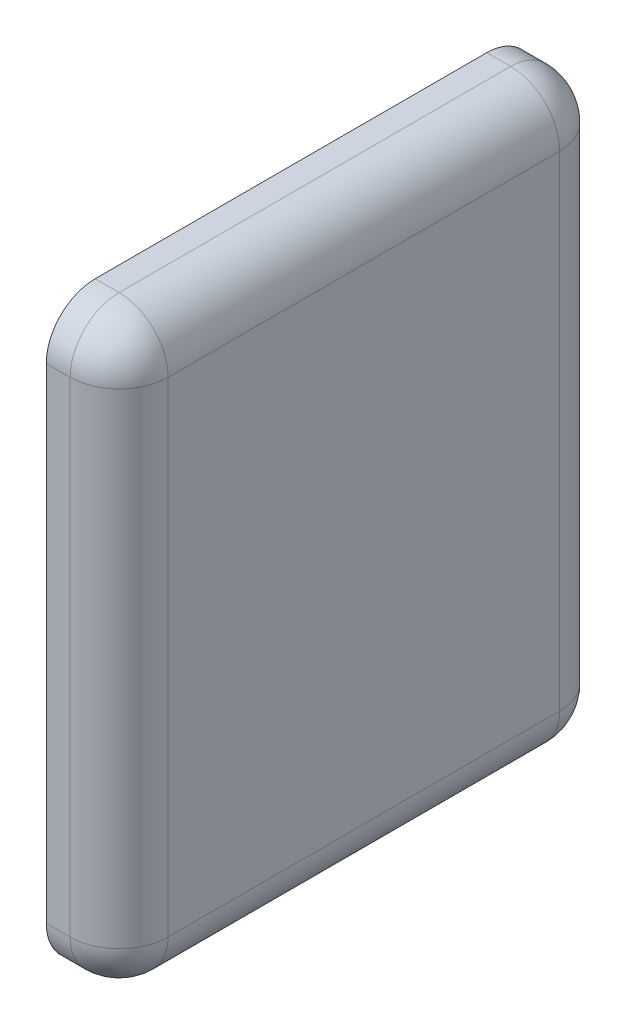
ISO-10303-21;
HEADER;
FILE_DESCRIPTION(('STEP AP214'),'2;1');
FILE_NAME('part.step','',(''),(''),'','','');
FILE_SCHEMA(('AUTOMOTIVE_DESIGN { 1 0 10303 214 1 1 1 1 }'));
ENDSEC;
DATA;
#1=APPLICATION_CONTEXT('core data for automotive mechanical design processes');
#2=APPLICATION_PROTOCOL_DEFINITION('international standard','automotive_design',2000,#1);
#3=PRODUCT_CONTEXT('',#1,'mechanical');
#4=PRODUCT('Part','Part','',(#3));
#5=PRODUCT_RELATED_PRODUCT_CATEGORY('part','',(#4));
#6=PRODUCT_DEFINITION_FORMATION('','',#4);
#7=PRODUCT_DEFINITION_CONTEXT('part definition',#1,'design');
#8=PRODUCT_DEFINITION('design','',#6,#7);
#9=PRODUCT_DEFINITION_SHAPE('','',#8);
#10=(LENGTH_UNIT() NAMED_UNIT(*) SI_UNIT(.MILLI.,.METRE.));
#11=(NAMED_UNIT(*) PLANE_ANGLE_UNIT() SI_UNIT($,.RADIAN.));
#12=(NAMED_UNIT(*) SI_UNIT($,.STERADIAN.) SOLID_ANGLE_UNIT());
#13=UNCERTAINTY_MEASURE_WITH_UNIT(LENGTH_MEASURE(1.E-05),#10,'distance_accuracy_value','');
#14=(GEOMETRIC_REPRESENTATION_CONTEXT(3) GLOBAL_UNCERTAINTY_ASSIGNED_CONTEXT((#13)) GLOBAL_UNIT_ASSIGNED_CONTEXT((#10,
#11,#12)) REPRESENTATION_CONTEXT('',''));
#15=CARTESIAN_POINT('',(0.,0.,0.));
#16=DIRECTION('',(0.,0.,1.));
#17=DIRECTION('',(1.,0.,0.));
#18=AXIS2_PLACEMENT_3D('',#15,#16,#17);
#19=CARTESIAN_POINT('',(2.225,-2.5,0.));
#20=DIRECTION('',(1.,0.,0.));
#21=DIRECTION('',(0.,0.,1.));
#22=AXIS2_PLACEMENT_3D('',#19,#20,#21);
#23=PLANE('',#22);
#24=CARTESIAN_POINT('',(2.225,-2.08,3.78));
#25=DIRECTION('',(-1.,0.,0.));
#26=DIRECTION('',(0.,0.,1.));
#27=AXIS2_PLACEMENT_3D('',#24,#25,#26);
#28=CIRCLE('',#27,0.42);
#29=CARTESIAN_POINT('',(2.225,-2.5,3.78));
#30=VERTEX_POINT('',#29);
#31=CARTESIAN_POINT('',(2.225,-2.08,4.2));
#32=VERTEX_POINT('',#31);
#33=EDGE_CURVE('E11',#30,#32,#28,.T.);
#34=ORIENTED_EDGE('',*,*,#33,.T.);
#35=DIRECTION('',(0.,1.,0.));
#36=VECTOR('',#35,1.);
#37=CARTESIAN_POINT('',(2.225,-2.5,4.2));
#38=LINE('',#37,#36);
#39=CARTESIAN_POINT('',(2.225,2.08,4.2));
#40=VERTEX_POINT('',#39);
#41=EDGE_CURVE('E24',#32,#40,#38,.T.);
#42=ORIENTED_EDGE('',*,*,#41,.T.);
#43=CARTESIAN_POINT('',(2.225,2.08,3.78));
#44=DIRECTION('',(1.,0.,0.));
#45=DIRECTION('',(0.,0.,1.));
#46=AXIS2_PLACEMENT_3D('',#43,#44,#45);
#47=CIRCLE('',#46,0.42);
#48=CARTESIAN_POINT('',(2.225,2.5,3.78));
#49=VERTEX_POINT('',#48);
#50=EDGE_CURVE('E195',#49,#40,#47,.T.);
#51=ORIENTED_EDGE('',*,*,#50,.F.);
#52=DIRECTION('',(0.,0.,1.));
#53=VECTOR('',#52,1.);
#54=CARTESIAN_POINT('',(2.225,2.5,0.));
#55=LINE('',#54,#53);
#56=CARTESIAN_POINT('',(2.225,2.5,0.42));
#57=VERTEX_POINT('',#56);
#58=EDGE_CURVE('E193',#57,#49,#55,.T.);
#59=ORIENTED_EDGE('',*,*,#58,.F.);
#60=CARTESIAN_POINT('',(2.225,2.08,0.42));
#61=DIRECTION('',(-1.,0.,0.));
#62=DIRECTION('',(0.,0.,1.));
#63=AXIS2_PLACEMENT_3D('',#60,#61,#62);
#64=CIRCLE('',#63,0.42);
#65=CARTESIAN_POINT('',(2.225,2.08,0.));
#66=VERTEX_POINT('',#65);
#67=EDGE_CURVE('E190',#57,#66,#64,.T.);
#68=ORIENTED_EDGE('',*,*,#67,.T.);
#69=DIRECTION('',(0.,1.,0.));
#70=VECTOR('',#69,1.);
#71=CARTESIAN_POINT('',(2.225,-2.5,0.));
#72=LINE('',#71,#70);
#73=CARTESIAN_POINT('',(2.225,-2.08,0.));
#74=VERTEX_POINT('',#73);
#75=EDGE_CURVE('E188',#74,#66,#72,.T.);
#76=ORIENTED_EDGE('',*,*,#75,.F.);
#77=CARTESIAN_POINT('',(2.225,-2.08,0.42));
#78=DIRECTION('',(1.,0.,0.));
#79=DIRECTION('',(0.,0.,1.));
#80=AXIS2_PLACEMENT_3D('',#77,#78,#79);
#81=CIRCLE('',#80,0.42);
#82=CARTESIAN_POINT('',(2.225,-2.5,0.42));
#83=VERTEX_POINT('',#82);
#84=EDGE_CURVE('E186',#83,#74,#81,.T.);
#85=ORIENTED_EDGE('',*,*,#84,.F.);
#86=DIRECTION('',(0.,0.,1.));
#87=VECTOR('',#86,1.);
#88=CARTESIAN_POINT('',(2.225,-2.5,0.));
#89=LINE('',#88,#87);
#90=EDGE_CURVE('E36',#83,#30,#89,.T.);
#91=ORIENTED_EDGE('',*,*,#90,.T.);
#92=EDGE_LOOP('',(#34,#42,#51,#59,#68,#76,#85,#91));
#93=FACE_BOUND('',#92,.T.);
#94=ADVANCED_FACE('F17',(#93),#23,.F.);
#95=CARTESIAN_POINT('',(2.225,-2.5,0.));
#96=DIRECTION('',(0.,1.,0.));
#97=DIRECTION('',(0.,0.,1.));
#98=AXIS2_PLACEMENT_3D('',#95,#96,#97);
#99=PLANE('',#98);
#100=DIRECTION('',(1.,0.,0.));
#101=VECTOR('',#100,1.);
#102=CARTESIAN_POINT('',(2.225,-2.5,0.42));
#103=LINE('',#102,#101);
#104=CARTESIAN_POINT('',(2.43,-2.5,0.42));
#105=VERTEX_POINT('',#104);
#106=EDGE_CURVE('E182',#83,#105,#103,.T.);
#107=ORIENTED_EDGE('',*,*,#106,.T.);
#108=DIRECTION('',(0.,0.,1.));
#109=VECTOR('',#108,1.);
#110=CARTESIAN_POINT('',(2.43,-2.5,0.));
#111=LINE('',#110,#109);
#112=CARTESIAN_POINT('',(2.43,-2.5,3.78));
#113=VERTEX_POINT('',#112);
#114=EDGE_CURVE('E179',#105,#113,#111,.T.);
#115=ORIENTED_EDGE('',*,*,#114,.T.);
#116=DIRECTION('',(1.,0.,0.));
#117=VECTOR('',#116,1.);
#118=CARTESIAN_POINT('',(2.225,-2.5,3.78));
#119=LINE('',#118,#117);
#120=EDGE_CURVE('E177',#30,#113,#119,.T.);
#121=ORIENTED_EDGE('',*,*,#120,.F.);
#122=ORIENTED_EDGE('',*,*,#90,.F.);
#123=EDGE_LOOP('',(#107,#115,#121,#122));
#124=FACE_BOUND('',#123,.T.);
#125=ADVANCED_FACE('F227',(#124),#99,.F.);
#126=CARTESIAN_POINT('',(2.225,-2.08,0.42));
#127=DIRECTION('',(1.,0.,0.));
#128=DIRECTION('',(0.,-1.,0.));
#129=AXIS2_PLACEMENT_3D('',#126,#127,#128);
#130=CYLINDRICAL_SURFACE('',#129,0.42);
#131=ORIENTED_EDGE('',*,*,#84,.T.);
#132=DIRECTION('',(1.,0.,0.));
#133=VECTOR('',#132,1.);
#134=CARTESIAN_POINT('',(2.225,-2.08,0.));
#135=LINE('',#134,#133);
#136=CARTESIAN_POINT('',(2.43,-2.08,0.));
#137=VERTEX_POINT('',#136);
#138=EDGE_CURVE('E175',#74,#137,#135,.T.);
#139=ORIENTED_EDGE('',*,*,#138,.T.);
#140=CARTESIAN_POINT('',(2.43,-2.08,0.42));
#141=DIRECTION('',(-1.,0.,0.));
#142=DIRECTION('',(0.,-1.,0.));
#143=AXIS2_PLACEMENT_3D('',#140,#141,#142);
#144=CIRCLE('',#143,0.42);
#145=EDGE_CURVE('E172',#137,#105,#144,.T.);
#146=ORIENTED_EDGE('',*,*,#145,.T.);
#147=ORIENTED_EDGE('',*,*,#106,.F.);
#148=EDGE_LOOP('',(#131,#139,#146,#147));
#149=FACE_BOUND('',#148,.T.);
#150=ADVANCED_FACE('F219',(#149),#130,.T.);
#151=CARTESIAN_POINT('',(2.225,-2.08,3.78));
#152=DIRECTION('',(1.,0.,0.));
#153=DIRECTION('',(0.,-1.,0.));
#154=AXIS2_PLACEMENT_3D('',#151,#152,#153);
#155=CYLINDRICAL_SURFACE('',#154,0.42);
#156=ORIENTED_EDGE('',*,*,#120,.T.);
#157=CARTESIAN_POINT('',(2.43,-2.08,3.78));
#158=DIRECTION('',(1.,0.,0.));
#159=DIRECTION('',(0.,-1.,0.));
#160=AXIS2_PLACEMENT_3D('',#157,#158,#159);
#161=CIRCLE('',#160,0.42);
#162=CARTESIAN_POINT('',(2.43,-2.08,4.2));
#163=VERTEX_POINT('',#162);
#164=EDGE_CURVE('E169',#163,#113,#161,.T.);
#165=ORIENTED_EDGE('',*,*,#164,.F.);
#166=DIRECTION('',(1.,0.,0.));
#167=VECTOR('',#166,1.);
#168=CARTESIAN_POINT('',(2.225,-2.08,4.2));
#169=LINE('',#168,#167);
#170=EDGE_CURVE('E167',#32,#163,#169,.T.);
#171=ORIENTED_EDGE('',*,*,#170,.F.);
#172=ORIENTED_EDGE('',*,*,#33,.F.);
#173=EDGE_LOOP('',(#156,#165,#171,#172));
#174=FACE_BOUND('',#173,.T.);
#175=ADVANCED_FACE('F229',(#174),#155,.T.);
#176=CARTESIAN_POINT('',(2.225,-2.5,0.));
#177=DIRECTION('',(0.,0.,1.));
#178=DIRECTION('',(1.,0.,0.));
#179=AXIS2_PLACEMENT_3D('',#176,#177,#178);
#180=PLANE('',#179);
#181=DIRECTION('',(1.,0.,0.));
#182=VECTOR('',#181,1.);
#183=CARTESIAN_POINT('',(2.225,2.08,0.));
#184=LINE('',#183,#182);
#185=CARTESIAN_POINT('',(2.43,2.08,0.));
#186=VERTEX_POINT('',#185);
#187=EDGE_CURVE('E164',#66,#186,#184,.T.);
#188=ORIENTED_EDGE('',*,*,#187,.T.);
#189=DIRECTION('',(0.,1.,0.));
#190=VECTOR('',#189,1.);
#191=CARTESIAN_POINT('',(2.43,-2.5,0.));
#192=LINE('',#191,#190);
#193=EDGE_CURVE('E162',#137,#186,#192,.T.);
#194=ORIENTED_EDGE('',*,*,#193,.F.);
#195=ORIENTED_EDGE('',*,*,#138,.F.);
#196=ORIENTED_EDGE('',*,*,#75,.T.);
#197=EDGE_LOOP('',(#188,#194,#195,#196));
#198=FACE_BOUND('',#197,.T.);
#199=ADVANCED_FACE('F215',(#198),#180,.F.);
#200=CARTESIAN_POINT('',(2.225,-2.5,4.2));
#201=DIRECTION('',(0.,0.,1.));
#202=DIRECTION('',(1.,0.,0.));
#203=AXIS2_PLACEMENT_3D('',#200,#201,#202);
#204=PLANE('',#203);
#205=ORIENTED_EDGE('',*,*,#41,.F.);
#206=ORIENTED_EDGE('',*,*,#170,.T.);
#207=DIRECTION('',(0.,1.,0.));
#208=VECTOR('',#207,1.);
#209=CARTESIAN_POINT('',(2.43,-2.5,4.2));
#210=LINE('',#209,#208);
#211=CARTESIAN_POINT('',(2.43,2.08,4.2));
#212=VERTEX_POINT('',#211);
#213=EDGE_CURVE('E160',#163,#212,#210,.T.);
#214=ORIENTED_EDGE('',*,*,#213,.T.);
#215=DIRECTION('',(1.,0.,0.));
#216=VECTOR('',#215,1.);
#217=CARTESIAN_POINT('',(2.225,2.08,4.2));
#218=LINE('',#217,#216);
#219=EDGE_CURVE('E157',#40,#212,#218,.T.);
#220=ORIENTED_EDGE('',*,*,#219,.F.);
#221=EDGE_LOOP('',(#205,#206,#214,#220));
#222=FACE_BOUND('',#221,.T.);
#223=ADVANCED_FACE('F200',(#222),#204,.T.);
#224=CARTESIAN_POINT('',(2.225,2.08,0.42));
#225=DIRECTION('',(1.,0.,0.));
#226=DIRECTION('',(0.,1.,0.));
#227=AXIS2_PLACEMENT_3D('',#224,#225,#226);
#228=CYLINDRICAL_SURFACE('',#227,0.42);
#229=DIRECTION('',(1.,0.,0.));
#230=VECTOR('',#229,1.);
#231=CARTESIAN_POINT('',(2.225,2.5,0.42));
#232=LINE('',#231,#230);
#233=CARTESIAN_POINT('',(2.43,2.5,0.42));
#234=VERTEX_POINT('',#233);
#235=EDGE_CURVE('E155',#57,#234,#232,.T.);
#236=ORIENTED_EDGE('',*,*,#235,.T.);
#237=CARTESIAN_POINT('',(2.43,2.08,0.42));
#238=DIRECTION('',(1.,0.,0.));
#239=DIRECTION('',(0.,1.,0.));
#240=AXIS2_PLACEMENT_3D('',#237,#238,#239);
#241=CIRCLE('',#240,0.42);
#242=EDGE_CURVE('E152',#186,#234,#241,.T.);
#243=ORIENTED_EDGE('',*,*,#242,.F.);
#244=ORIENTED_EDGE('',*,*,#187,.F.);
#245=ORIENTED_EDGE('',*,*,#67,.F.);
#246=EDGE_LOOP('',(#236,#243,#244,#245));
#247=FACE_BOUND('',#246,.T.);
#248=ADVANCED_FACE('F211',(#247),#228,.T.);
#249=CARTESIAN_POINT('',(2.225,2.08,3.78));
#250=DIRECTION('',(1.,0.,0.));
#251=DIRECTION('',(0.,1.,0.));
#252=AXIS2_PLACEMENT_3D('',#249,#250,#251);
#253=CYLINDRICAL_SURFACE('',#252,0.42);
#254=ORIENTED_EDGE('',*,*,#50,.T.);
#255=ORIENTED_EDGE('',*,*,#219,.T.);
#256=CARTESIAN_POINT('',(2.43,2.08,3.78));
#257=DIRECTION('',(1.,0.,0.));
#258=DIRECTION('',(0.,0.,1.));
#259=AXIS2_PLACEMENT_3D('',#256,#257,#258);
#260=CIRCLE('',#259,0.42);
#261=CARTESIAN_POINT('',(2.43,2.5,3.78));
#262=VERTEX_POINT('',#261);
#263=EDGE_CURVE('E112',#262,#212,#260,.T.);
#264=ORIENTED_EDGE('',*,*,#263,.F.);
#265=DIRECTION('',(1.,0.,0.));
#266=VECTOR('',#265,1.);
#267=CARTESIAN_POINT('',(2.225,2.5,3.78));
#268=LINE('',#267,#266);
#269=EDGE_CURVE('E148',#49,#262,#268,.T.);
#270=ORIENTED_EDGE('',*,*,#269,.F.);
#271=EDGE_LOOP('',(#254,#255,#264,#270));
#272=FACE_BOUND('',#271,.T.);
#273=ADVANCED_FACE('F202',(#272),#253,.T.);
#274=CARTESIAN_POINT('',(2.225,2.5,0.));
#275=DIRECTION('',(0.,1.,0.));
#276=DIRECTION('',(0.,0.,1.));
#277=AXIS2_PLACEMENT_3D('',#274,#275,#276);
#278=PLANE('',#277);
#279=ORIENTED_EDGE('',*,*,#58,.T.);
#280=ORIENTED_EDGE('',*,*,#269,.T.);
#281=DIRECTION('',(0.,0.,1.));
#282=VECTOR('',#281,1.);
#283=CARTESIAN_POINT('',(2.43,2.5,0.));
#284=LINE('',#283,#282);
#285=EDGE_CURVE('E122',#234,#262,#284,.T.);
#286=ORIENTED_EDGE('',*,*,#285,.F.);
#287=ORIENTED_EDGE('',*,*,#235,.F.);
#288=EDGE_LOOP('',(#279,#280,#286,#287));
#289=FACE_BOUND('',#288,.T.);
#290=ADVANCED_FACE('F204',(#289),#278,.T.);
#291=CARTESIAN_POINT('',(2.43,-2.08,0.));
#292=DIRECTION('',(0.,0.,1.));
#293=DIRECTION('',(1.,0.,0.));
#294=AXIS2_PLACEMENT_3D('',#291,#292,#293);
#295=CYLINDRICAL_SURFACE('',#294,0.42);
#296=CARTESIAN_POINT('',(2.43,-2.08,3.78));
#297=DIRECTION('',(0.,0.,-1.));
#298=DIRECTION('',(1.,0.,0.));
#299=AXIS2_PLACEMENT_3D('',#296,#297,#298);
#300=CIRCLE('',#299,0.42);
#301=CARTESIAN_POINT('',(2.85,-2.08,3.78));
#302=VERTEX_POINT('',#301);
#303=EDGE_CURVE('E144',#302,#113,#300,.T.);
#304=ORIENTED_EDGE('',*,*,#303,.T.);
#305=ORIENTED_EDGE('',*,*,#114,.F.);
#306=CARTESIAN_POINT('',(2.43,-2.08,0.42));
#307=DIRECTION('',(0.,0.,-1.));
#308=DIRECTION('',(1.,0.,0.));
#309=AXIS2_PLACEMENT_3D('',#306,#307,#308);
#310=CIRCLE('',#309,0.42);
#311=CARTESIAN_POINT('',(2.85,-2.08,0.42));
#312=VERTEX_POINT('',#311);
#313=EDGE_CURVE('E141',#312,#105,#310,.T.);
#314=ORIENTED_EDGE('',*,*,#313,.F.);
#315=DIRECTION('',(0.,0.,1.));
#316=VECTOR('',#315,1.);
#317=CARTESIAN_POINT('',(2.85,-2.08,0.));
#318=LINE('',#317,#316);
#319=EDGE_CURVE('E138',#312,#302,#318,.T.);
#320=ORIENTED_EDGE('',*,*,#319,.T.);
#321=EDGE_LOOP('',(#304,#305,#314,#320));
#322=FACE_BOUND('',#321,.T.);
#323=ADVANCED_FACE('F224',(#322),#295,.T.);
#324=CARTESIAN_POINT('',(2.43,-2.08,0.42));
#325=DIRECTION('',(0.,0.,1.));
#326=DIRECTION('',(1.,0.,0.));
#327=AXIS2_PLACEMENT_3D('',#324,#325,#326);
#328=SPHERICAL_SURFACE('',#327,0.42);
#329=ORIENTED_EDGE('',*,*,#313,.T.);
#330=ORIENTED_EDGE('',*,*,#145,.F.);
#331=CARTESIAN_POINT('',(2.43,-2.08,0.42));
#332=DIRECTION('',(0.,-1.,0.));
#333=DIRECTION('',(1.,0.,0.));
#334=AXIS2_PLACEMENT_3D('',#331,#332,#333);
#335=CIRCLE('',#334,0.42);
#336=EDGE_CURVE('E135',#137,#312,#335,.T.);
#337=ORIENTED_EDGE('',*,*,#336,.T.);
#338=EDGE_LOOP('',(#329,#330,#337));
#339=FACE_BOUND('',#338,.T.);
#340=ADVANCED_FACE('F222',(#339),#328,.T.);
#341=CARTESIAN_POINT('',(2.43,-2.08,3.78));
#342=DIRECTION('',(0.,0.,-1.));
#343=DIRECTION('',(1.,0.,0.));
#344=AXIS2_PLACEMENT_3D('',#341,#342,#343);
#345=SPHERICAL_SURFACE('',#344,0.42);
#346=CARTESIAN_POINT('',(2.43,-2.08,3.78));
#347=DIRECTION('',(0.,1.,0.));
#348=DIRECTION('',(1.,0.,0.));
#349=AXIS2_PLACEMENT_3D('',#346,#347,#348);
#350=CIRCLE('',#349,0.42);
#351=EDGE_CURVE('E100',#163,#302,#350,.T.);
#352=ORIENTED_EDGE('',*,*,#351,.F.);
#353=ORIENTED_EDGE('',*,*,#164,.T.);
#354=ORIENTED_EDGE('',*,*,#303,.F.);
#355=EDGE_LOOP('',(#352,#353,#354));
#356=FACE_BOUND('',#355,.T.);
#357=ADVANCED_FACE('F231',(#356),#345,.T.);
#358=CARTESIAN_POINT('',(2.43,-2.5,0.42));
#359=DIRECTION('',(0.,1.,0.));
#360=DIRECTION('',(1.,0.,0.));
#361=AXIS2_PLACEMENT_3D('',#358,#359,#360);
#362=CYLINDRICAL_SURFACE('',#361,0.42);
#363=ORIENTED_EDGE('',*,*,#336,.F.);
#364=ORIENTED_EDGE('',*,*,#193,.T.);
#365=CARTESIAN_POINT('',(2.43,2.08,0.42));
#366=DIRECTION('',(0.,-1.,0.));
#367=DIRECTION('',(1.,0.,0.));
#368=AXIS2_PLACEMENT_3D('',#365,#366,#367);
#369=CIRCLE('',#368,0.42);
#370=CARTESIAN_POINT('',(2.85,2.08,0.42));
#371=VERTEX_POINT('',#370);
#372=EDGE_CURVE('E132',#186,#371,#369,.T.);
#373=ORIENTED_EDGE('',*,*,#372,.T.);
#374=DIRECTION('',(0.,1.,0.));
#375=VECTOR('',#374,1.);
#376=CARTESIAN_POINT('',(2.85,-2.5,0.42));
#377=LINE('',#376,#375);
#378=EDGE_CURVE('E104',#312,#371,#377,.T.);
#379=ORIENTED_EDGE('',*,*,#378,.F.);
#380=EDGE_LOOP('',(#363,#364,#373,#379));
#381=FACE_BOUND('',#380,.T.);
#382=ADVANCED_FACE('F233',(#381),#362,.T.);
#383=CARTESIAN_POINT('',(2.43,-2.5,3.78));
#384=DIRECTION('',(0.,1.,0.));
#385=DIRECTION('',(1.,0.,0.));
#386=AXIS2_PLACEMENT_3D('',#383,#384,#385);
#387=CYLINDRICAL_SURFACE('',#386,0.42);
#388=DIRECTION('',(0.,1.,0.));
#389=VECTOR('',#388,1.);
#390=CARTESIAN_POINT('',(2.85,-2.5,3.78));
#391=LINE('',#390,#389);
#392=CARTESIAN_POINT('',(2.85,2.08,3.78));
#393=VERTEX_POINT('',#392);
#394=EDGE_CURVE('E94',#302,#393,#391,.T.);
#395=ORIENTED_EDGE('',*,*,#394,.T.);
#396=CARTESIAN_POINT('',(2.43,2.08,3.78));
#397=DIRECTION('',(0.,-1.,0.));
#398=DIRECTION('',(1.,0.,0.));
#399=AXIS2_PLACEMENT_3D('',#396,#397,#398);
#400=CIRCLE('',#399,0.42);
#401=EDGE_CURVE('E98',#393,#212,#400,.T.);
#402=ORIENTED_EDGE('',*,*,#401,.T.);
#403=ORIENTED_EDGE('',*,*,#213,.F.);
#404=ORIENTED_EDGE('',*,*,#351,.T.);
#405=EDGE_LOOP('',(#395,#402,#403,#404));
#406=FACE_BOUND('',#405,.T.);
#407=ADVANCED_FACE('F96',(#406),#387,.T.);
#408=CARTESIAN_POINT('',(2.43,2.08,0.42));
#409=DIRECTION('',(0.,0.,1.));
#410=DIRECTION('',(1.,0.,0.));
#411=AXIS2_PLACEMENT_3D('',#408,#409,#410);
#412=SPHERICAL_SURFACE('',#411,0.42);
#413=ORIENTED_EDGE('',*,*,#372,.F.);
#414=ORIENTED_EDGE('',*,*,#242,.T.);
#415=CARTESIAN_POINT('',(2.43,2.08,0.42));
#416=DIRECTION('',(0.,0.,1.));
#417=DIRECTION('',(1.,0.,0.));
#418=AXIS2_PLACEMENT_3D('',#415,#416,#417);
#419=CIRCLE('',#418,0.42);
#420=EDGE_CURVE('E113',#371,#234,#419,.T.);
#421=ORIENTED_EDGE('',*,*,#420,.F.);
#422=EDGE_LOOP('',(#413,#414,#421));
#423=FACE_BOUND('',#422,.T.);
#424=ADVANCED_FACE('F300',(#423),#412,.T.);
#425=CARTESIAN_POINT('',(2.43,2.08,3.78));
#426=DIRECTION('',(0.,-1.,0.));
#427=DIRECTION('',(1.,0.,0.));
#428=AXIS2_PLACEMENT_3D('',#425,#426,#427);
#429=SPHERICAL_SURFACE('',#428,0.42);
#430=CARTESIAN_POINT('',(2.43,2.08,3.78));
#431=DIRECTION('',(0.,0.,-1.));
#432=DIRECTION('',(1.,0.,0.));
#433=AXIS2_PLACEMENT_3D('',#430,#431,#432);
#434=CIRCLE('',#433,0.42);
#435=EDGE_CURVE('E111',#262,#393,#434,.T.);
#436=ORIENTED_EDGE('',*,*,#435,.F.);
#437=ORIENTED_EDGE('',*,*,#263,.T.);
#438=ORIENTED_EDGE('',*,*,#401,.F.);
#439=EDGE_LOOP('',(#436,#437,#438));
#440=FACE_BOUND('',#439,.T.);
#441=ADVANCED_FACE('F110',(#440),#429,.T.);
#442=CARTESIAN_POINT('',(2.43,2.08,0.));
#443=DIRECTION('',(0.,0.,1.));
#444=DIRECTION('',(1.,0.,0.));
#445=AXIS2_PLACEMENT_3D('',#442,#443,#444);
#446=CYLINDRICAL_SURFACE('',#445,0.42);
#447=DIRECTION('',(0.,0.,1.));
#448=VECTOR('',#447,1.);
#449=CARTESIAN_POINT('',(2.85,2.08,0.));
#450=LINE('',#449,#448);
#451=EDGE_CURVE('E120',#371,#393,#450,.T.);
#452=ORIENTED_EDGE('',*,*,#451,.F.);
#453=ORIENTED_EDGE('',*,*,#420,.T.);
#454=ORIENTED_EDGE('',*,*,#285,.T.);
#455=ORIENTED_EDGE('',*,*,#435,.T.);
#456=EDGE_LOOP('',(#452,#453,#454,#455));
#457=FACE_BOUND('',#456,.T.);
#458=ADVANCED_FACE('F118',(#457),#446,.T.);
#459=CARTESIAN_POINT('',(2.85,-2.5,0.));
#460=DIRECTION('',(1.,0.,0.));
#461=DIRECTION('',(0.,0.,1.));
#462=AXIS2_PLACEMENT_3D('',#459,#460,#461);
#463=PLANE('',#462);
#464=ORIENTED_EDGE('',*,*,#319,.F.);
#465=ORIENTED_EDGE('',*,*,#378,.T.);
#466=ORIENTED_EDGE('',*,*,#451,.T.);
#467=ORIENTED_EDGE('',*,*,#394,.F.);
#468=EDGE_LOOP('',(#464,#465,#466,#467));
#469=FACE_BOUND('',#468,.T.);
#470=ADVANCED_FACE('F125',(#469),#463,.T.);
#471=CLOSED_SHELL('',(#94,#125,#150,#175,#199,#223,#248,#273,#290,#323,#340,#357,#382,#407,#424,
#441,#458,#470));
#472=MANIFOLD_SOLID_BREP('B1',#471);
#473=ADVANCED_BREP_SHAPE_REPRESENTATION('',(#18,#472),#14);
#474=SHAPE_DEFINITION_REPRESENTATION(#9,#473);
ENDSEC;
END-ISO-10303-21;
